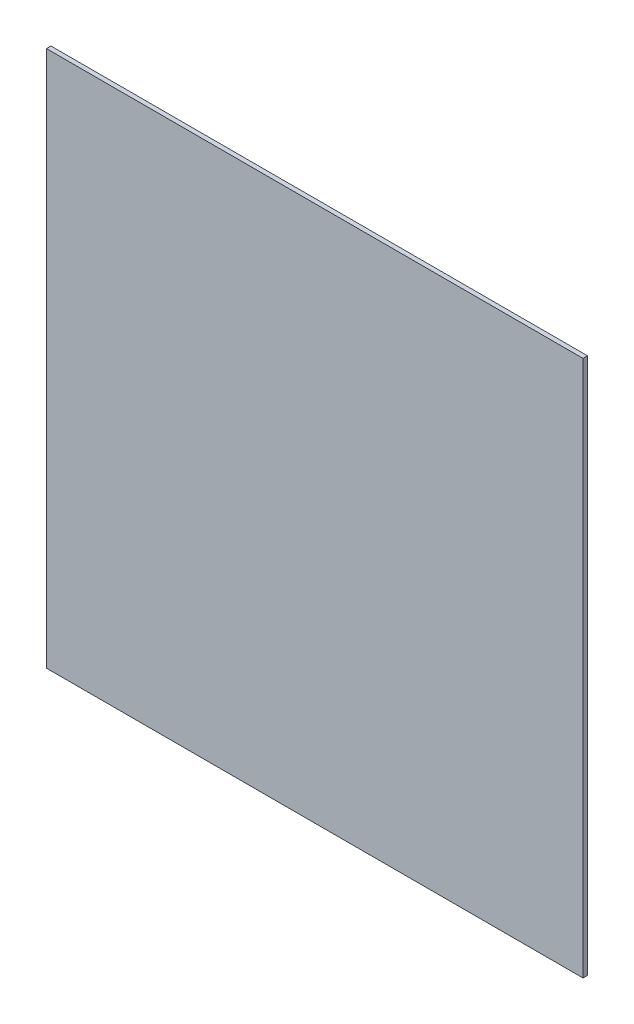
ISO-10303-21;
HEADER;
FILE_DESCRIPTION(('STEP AP214'),'2;1');
FILE_NAME('part.step','',(''),(''),'','','');
FILE_SCHEMA(('AUTOMOTIVE_DESIGN { 1 0 10303 214 1 1 1 1 }'));
ENDSEC;
DATA;
#1=APPLICATION_CONTEXT('core data for automotive mechanical design processes');
#2=APPLICATION_PROTOCOL_DEFINITION('international standard','automotive_design',2000,#1);
#3=PRODUCT_CONTEXT('',#1,'mechanical');
#4=PRODUCT('Part','Part','',(#3));
#5=PRODUCT_RELATED_PRODUCT_CATEGORY('part','',(#4));
#6=PRODUCT_DEFINITION_FORMATION('','',#4);
#7=PRODUCT_DEFINITION_CONTEXT('part definition',#1,'design');
#8=PRODUCT_DEFINITION('design','',#6,#7);
#9=PRODUCT_DEFINITION_SHAPE('','',#8);
#10=(LENGTH_UNIT() NAMED_UNIT(*) SI_UNIT(.MILLI.,.METRE.));
#11=(NAMED_UNIT(*) PLANE_ANGLE_UNIT() SI_UNIT($,.RADIAN.));
#12=(NAMED_UNIT(*) SI_UNIT($,.STERADIAN.) SOLID_ANGLE_UNIT());
#13=UNCERTAINTY_MEASURE_WITH_UNIT(LENGTH_MEASURE(1.E-05),#10,'distance_accuracy_value','');
#14=(GEOMETRIC_REPRESENTATION_CONTEXT(3) GLOBAL_UNCERTAINTY_ASSIGNED_CONTEXT((#13)) GLOBAL_UNIT_ASSIGNED_CONTEXT((#10,
#11,#12)) REPRESENTATION_CONTEXT('',''));
#15=CARTESIAN_POINT('',(0.,0.,0.));
#16=DIRECTION('',(0.,0.,1.));
#17=DIRECTION('',(1.,0.,0.));
#18=AXIS2_PLACEMENT_3D('',#15,#16,#17);
#19=CARTESIAN_POINT('',(-59.69,59.69,0.5));
#20=DIRECTION('',(1.,0.,0.));
#21=DIRECTION('',(0.,0.,-1.));
#22=AXIS2_PLACEMENT_3D('',#19,#20,#21);
#23=PLANE('',#22);
#24=DIRECTION('',(0.,-1.,0.));
#25=VECTOR('',#24,1.);
#26=CARTESIAN_POINT('',(-59.69,59.69,-0.5));
#27=LINE('',#26,#25);
#28=CARTESIAN_POINT('',(-59.69,59.69,-0.5));
#29=VERTEX_POINT('',#28);
#30=CARTESIAN_POINT('',(-59.69,-59.69,-0.5));
#31=VERTEX_POINT('',#30);
#32=EDGE_CURVE('E96',#29,#31,#27,.T.);
#33=ORIENTED_EDGE('',*,*,#32,.T.);
#34=DIRECTION('',(0.,0.,-1.));
#35=VECTOR('',#34,1.);
#36=CARTESIAN_POINT('',(-59.69,-59.69,0.5));
#37=LINE('',#36,#35);
#38=CARTESIAN_POINT('',(-59.69,-59.69,0.5));
#39=VERTEX_POINT('',#38);
#40=EDGE_CURVE('E11',#39,#31,#37,.T.);
#41=ORIENTED_EDGE('',*,*,#40,.F.);
#42=DIRECTION('',(0.,-1.,0.));
#43=VECTOR('',#42,1.);
#44=CARTESIAN_POINT('',(-59.69,59.69,0.5));
#45=LINE('',#44,#43);
#46=CARTESIAN_POINT('',(-59.69,59.69,0.5));
#47=VERTEX_POINT('',#46);
#48=EDGE_CURVE('E84',#47,#39,#45,.T.);
#49=ORIENTED_EDGE('',*,*,#48,.F.);
#50=DIRECTION('',(0.,0.,-1.));
#51=VECTOR('',#50,1.);
#52=CARTESIAN_POINT('',(-59.69,59.69,0.5));
#53=LINE('',#52,#51);
#54=EDGE_CURVE('E92',#47,#29,#53,.T.);
#55=ORIENTED_EDGE('',*,*,#54,.T.);
#56=EDGE_LOOP('',(#33,#41,#49,#55));
#57=FACE_BOUND('',#56,.T.);
#58=ADVANCED_FACE('F33',(#57),#23,.F.);
#59=CARTESIAN_POINT('',(-59.69,-59.69,0.5));
#60=DIRECTION('',(0.,1.,0.));
#61=DIRECTION('',(0.,0.,1.));
#62=AXIS2_PLACEMENT_3D('',#59,#60,#61);
#63=PLANE('',#62);
#64=DIRECTION('',(1.,0.,0.));
#65=VECTOR('',#64,1.);
#66=CARTESIAN_POINT('',(-59.69,-59.69,-0.5));
#67=LINE('',#66,#65);
#68=CARTESIAN_POINT('',(59.69,-59.69,-0.5));
#69=VERTEX_POINT('',#68);
#70=EDGE_CURVE('E88',#31,#69,#67,.T.);
#71=ORIENTED_EDGE('',*,*,#70,.T.);
#72=DIRECTION('',(0.,0.,-1.));
#73=VECTOR('',#72,1.);
#74=CARTESIAN_POINT('',(59.69,-59.69,0.5));
#75=LINE('',#74,#73);
#76=CARTESIAN_POINT('',(59.69,-59.69,0.5));
#77=VERTEX_POINT('',#76);
#78=EDGE_CURVE('E41',#77,#69,#75,.T.);
#79=ORIENTED_EDGE('',*,*,#78,.F.);
#80=DIRECTION('',(1.,0.,0.));
#81=VECTOR('',#80,1.);
#82=CARTESIAN_POINT('',(-59.69,-59.69,0.5));
#83=LINE('',#82,#81);
#84=EDGE_CURVE('E79',#39,#77,#83,.T.);
#85=ORIENTED_EDGE('',*,*,#84,.F.);
#86=ORIENTED_EDGE('',*,*,#40,.T.);
#87=EDGE_LOOP('',(#71,#79,#85,#86));
#88=FACE_BOUND('',#87,.T.);
#89=ADVANCED_FACE('F87',(#88),#63,.F.);
#90=CARTESIAN_POINT('',(59.69,59.69,0.5));
#91=DIRECTION('',(-1.,0.,0.));
#92=DIRECTION('',(0.,0.,1.));
#93=AXIS2_PLACEMENT_3D('',#90,#91,#92);
#94=PLANE('',#93);
#95=DIRECTION('',(0.,1.,0.));
#96=VECTOR('',#95,1.);
#97=CARTESIAN_POINT('',(59.69,59.69,-0.5));
#98=LINE('',#97,#96);
#99=CARTESIAN_POINT('',(59.69,59.69,-0.5));
#100=VERTEX_POINT('',#99);
#101=EDGE_CURVE('E66',#69,#100,#98,.T.);
#102=ORIENTED_EDGE('',*,*,#101,.T.);
#103=DIRECTION('',(0.,0.,-1.));
#104=VECTOR('',#103,1.);
#105=CARTESIAN_POINT('',(59.69,59.69,0.5));
#106=LINE('',#105,#104);
#107=CARTESIAN_POINT('',(59.69,59.69,0.5));
#108=VERTEX_POINT('',#107);
#109=EDGE_CURVE('E89',#108,#100,#106,.T.);
#110=ORIENTED_EDGE('',*,*,#109,.F.);
#111=DIRECTION('',(0.,1.,0.));
#112=VECTOR('',#111,1.);
#113=CARTESIAN_POINT('',(59.69,59.69,0.5));
#114=LINE('',#113,#112);
#115=EDGE_CURVE('E82',#77,#108,#114,.T.);
#116=ORIENTED_EDGE('',*,*,#115,.F.);
#117=ORIENTED_EDGE('',*,*,#78,.T.);
#118=EDGE_LOOP('',(#102,#110,#116,#117));
#119=FACE_BOUND('',#118,.T.);
#120=ADVANCED_FACE('F90',(#119),#94,.F.);
#121=CARTESIAN_POINT('',(-59.69,59.69,0.5));
#122=DIRECTION('',(0.,-1.,0.));
#123=DIRECTION('',(0.,0.,-1.));
#124=AXIS2_PLACEMENT_3D('',#121,#122,#123);
#125=PLANE('',#124);
#126=DIRECTION('',(-1.,0.,0.));
#127=VECTOR('',#126,1.);
#128=CARTESIAN_POINT('',(-59.69,59.69,-0.5));
#129=LINE('',#128,#127);
#130=EDGE_CURVE('E72',#100,#29,#129,.T.);
#131=ORIENTED_EDGE('',*,*,#130,.T.);
#132=ORIENTED_EDGE('',*,*,#54,.F.);
#133=DIRECTION('',(-1.,0.,0.));
#134=VECTOR('',#133,1.);
#135=CARTESIAN_POINT('',(-59.69,59.69,0.5));
#136=LINE('',#135,#134);
#137=EDGE_CURVE('E49',#108,#47,#136,.T.);
#138=ORIENTED_EDGE('',*,*,#137,.F.);
#139=ORIENTED_EDGE('',*,*,#109,.T.);
#140=EDGE_LOOP('',(#131,#132,#138,#139));
#141=FACE_BOUND('',#140,.T.);
#142=ADVANCED_FACE('F103',(#141),#125,.F.);
#143=CARTESIAN_POINT('',(0.,0.,0.5));
#144=DIRECTION('',(0.,0.,1.));
#145=DIRECTION('',(1.,0.,0.));
#146=AXIS2_PLACEMENT_3D('',#143,#144,#145);
#147=PLANE('',#146);
#148=ORIENTED_EDGE('',*,*,#48,.T.);
#149=ORIENTED_EDGE('',*,*,#84,.T.);
#150=ORIENTED_EDGE('',*,*,#115,.T.);
#151=ORIENTED_EDGE('',*,*,#137,.T.);
#152=EDGE_LOOP('',(#148,#149,#150,#151));
#153=FACE_BOUND('',#152,.T.);
#154=ADVANCED_FACE('F80',(#153),#147,.T.);
#155=CARTESIAN_POINT('',(0.,0.,-0.5));
#156=DIRECTION('',(0.,0.,1.));
#157=DIRECTION('',(1.,0.,0.));
#158=AXIS2_PLACEMENT_3D('',#155,#156,#157);
#159=PLANE('',#158);
#160=ORIENTED_EDGE('',*,*,#32,.F.);
#161=ORIENTED_EDGE('',*,*,#130,.F.);
#162=ORIENTED_EDGE('',*,*,#101,.F.);
#163=ORIENTED_EDGE('',*,*,#70,.F.);
#164=EDGE_LOOP('',(#160,#161,#162,#163));
#165=FACE_BOUND('',#164,.T.);
#166=ADVANCED_FACE('F106',(#165),#159,.F.);
#167=CLOSED_SHELL('',(#58,#89,#120,#142,#154,#166));
#168=MANIFOLD_SOLID_BREP('B2',#167);
#169=ADVANCED_BREP_SHAPE_REPRESENTATION('',(#18,#168),#14);
#170=SHAPE_DEFINITION_REPRESENTATION(#9,#169);
ENDSEC;
END-ISO-10303-21;
